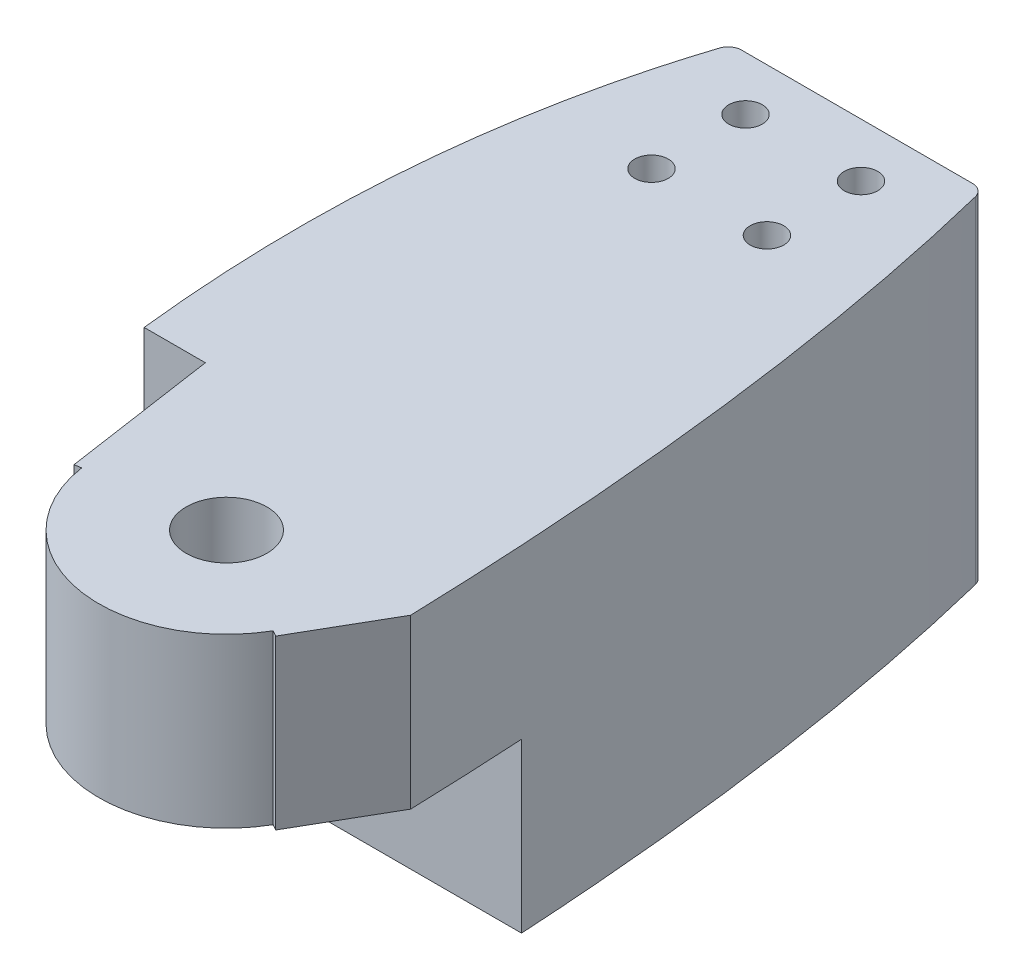
ISO-10303-21;
HEADER;
FILE_DESCRIPTION(('STEP AP214'),'2;1');
FILE_NAME('part.step','',(''),(''),'','','');
FILE_SCHEMA(('AUTOMOTIVE_DESIGN { 1 0 10303 214 1 1 1 1 }'));
ENDSEC;
DATA;
#1=APPLICATION_CONTEXT('core data for automotive mechanical design processes');
#2=APPLICATION_PROTOCOL_DEFINITION('international standard','automotive_design',2000,#1);
#3=PRODUCT_CONTEXT('',#1,'mechanical');
#4=PRODUCT('Part','Part','',(#3));
#5=PRODUCT_RELATED_PRODUCT_CATEGORY('part','',(#4));
#6=PRODUCT_DEFINITION_FORMATION('','',#4);
#7=PRODUCT_DEFINITION_CONTEXT('part definition',#1,'design');
#8=PRODUCT_DEFINITION('design','',#6,#7);
#9=PRODUCT_DEFINITION_SHAPE('','',#8);
#10=(LENGTH_UNIT() NAMED_UNIT(*) SI_UNIT(.MILLI.,.METRE.));
#11=(NAMED_UNIT(*) PLANE_ANGLE_UNIT() SI_UNIT($,.RADIAN.));
#12=(NAMED_UNIT(*) SI_UNIT($,.STERADIAN.) SOLID_ANGLE_UNIT());
#13=UNCERTAINTY_MEASURE_WITH_UNIT(LENGTH_MEASURE(1.E-05),#10,'distance_accuracy_value','');
#14=(GEOMETRIC_REPRESENTATION_CONTEXT(3) GLOBAL_UNCERTAINTY_ASSIGNED_CONTEXT((#13)) GLOBAL_UNIT_ASSIGNED_CONTEXT((#10,
#11,#12)) REPRESENTATION_CONTEXT('',''));
#15=CARTESIAN_POINT('',(0.,0.,0.));
#16=DIRECTION('',(0.,0.,1.));
#17=DIRECTION('',(1.,0.,0.));
#18=AXIS2_PLACEMENT_3D('',#15,#16,#17);
#19=CARTESIAN_POINT('',(0.,0.,0.));
#20=DIRECTION('',(0.,0.,-1.));
#21=DIRECTION('',(-1.,0.,0.));
#22=AXIS2_PLACEMENT_3D('',#19,#20,#21);
#23=PLANE('',#22);
#24=DIRECTION('',(-1.,0.,0.));
#25=VECTOR('',#24,1.);
#26=CARTESIAN_POINT('',(3.4106537573047,10.,0.));
#27=LINE('',#26,#25);
#28=CARTESIAN_POINT('',(3.4106537573047,10.,0.));
#29=VERTEX_POINT('',#28);
#30=CARTESIAN_POINT('',(-1.18269285677627,10.,0.));
#31=VERTEX_POINT('',#30);
#32=EDGE_CURVE('E282',#29,#31,#27,.T.);
#33=ORIENTED_EDGE('',*,*,#32,.T.);
#34=DIRECTION('',(0.,-1.,0.));
#35=VECTOR('',#34,1.);
#36=CARTESIAN_POINT('',(-1.18269285677627,10.,0.));
#37=LINE('',#36,#35);
#38=CARTESIAN_POINT('',(-1.18269285677627,-10.,0.));
#39=VERTEX_POINT('',#38);
#40=EDGE_CURVE('E264',#31,#39,#37,.T.);
#41=ORIENTED_EDGE('',*,*,#40,.T.);
#42=DIRECTION('',(-1.,0.,0.));
#43=VECTOR('',#42,1.);
#44=CARTESIAN_POINT('',(3.4106537573047,-10.,0.));
#45=LINE('',#44,#43);
#46=CARTESIAN_POINT('',(3.4106537573047,-10.,0.));
#47=VERTEX_POINT('',#46);
#48=EDGE_CURVE('E271',#47,#39,#45,.T.);
#49=ORIENTED_EDGE('',*,*,#48,.F.);
#50=DIRECTION('',(0.,-1.,0.));
#51=VECTOR('',#50,1.);
#52=CARTESIAN_POINT('',(3.4106537573047,10.,0.));
#53=LINE('',#52,#51);
#54=EDGE_CURVE('E963',#29,#47,#53,.T.);
#55=ORIENTED_EDGE('',*,*,#54,.F.);
#56=EDGE_LOOP('',(#33,#41,#49,#55));
#57=FACE_BOUND('',#56,.T.);
#58=DIRECTION('',(1.,0.,0.));
#59=VECTOR('',#58,1.);
#60=CARTESIAN_POINT('',(-12.5,12.5,0.));
#61=LINE('',#60,#59);
#62=CARTESIAN_POINT('',(-11.7760394708572,12.5,0.));
#63=VERTEX_POINT('',#62);
#64=CARTESIAN_POINT('',(5.4106537573047,12.5,0.));
#65=VERTEX_POINT('',#64);
#66=EDGE_CURVE('E492',#63,#65,#61,.T.);
#67=ORIENTED_EDGE('',*,*,#66,.T.);
#68=DIRECTION('',(0.,-1.,0.));
#69=VECTOR('',#68,1.);
#70=CARTESIAN_POINT('',(5.4106537573047,0.,0.));
#71=LINE('',#70,#69);
#72=CARTESIAN_POINT('',(5.4106537573047,-12.5,0.));
#73=VERTEX_POINT('',#72);
#74=EDGE_CURVE('E522',#65,#73,#71,.T.);
#75=ORIENTED_EDGE('',*,*,#74,.T.);
#76=DIRECTION('',(1.,0.,0.));
#77=VECTOR('',#76,1.);
#78=CARTESIAN_POINT('',(-12.5,-12.5,0.));
#79=LINE('',#78,#77);
#80=CARTESIAN_POINT('',(-11.7760394708572,-12.5,0.));
#81=VERTEX_POINT('',#80);
#82=EDGE_CURVE('E507',#81,#73,#79,.T.);
#83=ORIENTED_EDGE('',*,*,#82,.F.);
#84=DIRECTION('',(0.,-1.,0.));
#85=VECTOR('',#84,1.);
#86=CARTESIAN_POINT('',(-11.7760394708572,0.,0.));
#87=LINE('',#86,#85);
#88=EDGE_CURVE('E518',#81,#63,#87,.F.);
#89=ORIENTED_EDGE('',*,*,#88,.T.);
#90=EDGE_LOOP('',(#67,#75,#83,#89));
#91=FACE_BOUND('',#90,.T.);
#92=DIRECTION('',(0.,-1.,0.));
#93=VECTOR('',#92,1.);
#94=CARTESIAN_POINT('',(-5.18269285677627,10.,0.));
#95=LINE('',#94,#93);
#96=CARTESIAN_POINT('',(-5.18269285677627,10.,0.));
#97=VERTEX_POINT('',#96);
#98=CARTESIAN_POINT('',(-5.18269285677627,-10.,0.));
#99=VERTEX_POINT('',#98);
#100=EDGE_CURVE('E295',#97,#99,#95,.T.);
#101=ORIENTED_EDGE('',*,*,#100,.F.);
#102=DIRECTION('',(1.,0.,0.));
#103=VECTOR('',#102,1.);
#104=CARTESIAN_POINT('',(-9.77603947085724,10.,0.));
#105=LINE('',#104,#103);
#106=CARTESIAN_POINT('',(-9.77603947085724,10.,0.));
#107=VERTEX_POINT('',#106);
#108=EDGE_CURVE('E318',#107,#97,#105,.T.);
#109=ORIENTED_EDGE('',*,*,#108,.F.);
#110=DIRECTION('',(0.,-1.,0.));
#111=VECTOR('',#110,1.);
#112=CARTESIAN_POINT('',(-9.77603947085724,10.,0.));
#113=LINE('',#112,#111);
#114=CARTESIAN_POINT('',(-9.77603947085724,-10.,0.));
#115=VERTEX_POINT('',#114);
#116=EDGE_CURVE('E305',#107,#115,#113,.T.);
#117=ORIENTED_EDGE('',*,*,#116,.T.);
#118=DIRECTION('',(1.,0.,0.));
#119=VECTOR('',#118,1.);
#120=CARTESIAN_POINT('',(-9.77603947085724,-10.,0.));
#121=LINE('',#120,#119);
#122=EDGE_CURVE('E279',#115,#99,#121,.T.);
#123=ORIENTED_EDGE('',*,*,#122,.T.);
#124=EDGE_LOOP('',(#101,#109,#117,#123));
#125=FACE_BOUND('',#124,.T.);
#126=ADVANCED_FACE('F119',(#57,#91,#125),#23,.T.);
#127=CARTESIAN_POINT('',(1.11398045026422,22.,4.));
#128=DIRECTION('',(0.,-1.,0.));
#129=DIRECTION('',(0.,0.,-1.));
#130=AXIS2_PLACEMENT_3D('',#127,#128,#129);
#131=CYLINDRICAL_SURFACE('',#130,1.25);
#132=CARTESIAN_POINT('',(1.11398045026422,-12.5,4.));
#133=DIRECTION('',(0.,1.,0.));
#134=DIRECTION('',(0.,0.,1.));
#135=AXIS2_PLACEMENT_3D('',#132,#133,#134);
#136=CIRCLE('',#135,1.25);
#137=CARTESIAN_POINT('',(1.11398045026422,-12.5,5.25));
#138=VERTEX_POINT('',#137);
#139=EDGE_CURVE('E351',#138,#138,#136,.F.);
#140=ORIENTED_EDGE('',*,*,#139,.T.);
#141=EDGE_LOOP('',(#140));
#142=FACE_BOUND('',#141,.T.);
#143=CARTESIAN_POINT('',(1.11398045026422,-10.,4.));
#144=DIRECTION('',(0.,1.,0.));
#145=DIRECTION('',(0.,0.,1.));
#146=AXIS2_PLACEMENT_3D('',#143,#144,#145);
#147=CIRCLE('',#146,1.25);
#148=CARTESIAN_POINT('',(1.11398045026422,-10.,5.25));
#149=VERTEX_POINT('',#148);
#150=EDGE_CURVE('E289',#149,#149,#147,.T.);
#151=ORIENTED_EDGE('',*,*,#150,.T.);
#152=EDGE_LOOP('',(#151));
#153=FACE_BOUND('',#152,.T.);
#154=ADVANCED_FACE('F579',(#142,#153),#131,.F.);
#155=CARTESIAN_POINT('',(-7.47936616381675,22.,11.));
#156=DIRECTION('',(0.,-1.,0.));
#157=DIRECTION('',(0.,0.,-1.));
#158=AXIS2_PLACEMENT_3D('',#155,#156,#157);
#159=CYLINDRICAL_SURFACE('',#158,1.25);
#160=CARTESIAN_POINT('',(-7.47936616381675,12.5,11.));
#161=DIRECTION('',(0.,1.,0.));
#162=DIRECTION('',(0.,0.,1.));
#163=AXIS2_PLACEMENT_3D('',#160,#161,#162);
#164=CIRCLE('',#163,1.25);
#165=CARTESIAN_POINT('',(-7.47936616381675,12.5,12.25));
#166=VERTEX_POINT('',#165);
#167=EDGE_CURVE('E357',#166,#166,#164,.F.);
#168=ORIENTED_EDGE('',*,*,#167,.F.);
#169=EDGE_LOOP('',(#168));
#170=FACE_BOUND('',#169,.T.);
#171=CARTESIAN_POINT('',(-7.47936616381675,10.,11.));
#172=DIRECTION('',(0.,-1.,0.));
#173=DIRECTION('',(0.,0.,-1.));
#174=AXIS2_PLACEMENT_3D('',#171,#172,#173);
#175=CIRCLE('',#174,1.25);
#176=CARTESIAN_POINT('',(-7.47936616381675,10.,9.75));
#177=VERTEX_POINT('',#176);
#178=EDGE_CURVE('E347',#177,#177,#175,.T.);
#179=ORIENTED_EDGE('',*,*,#178,.T.);
#180=EDGE_LOOP('',(#179));
#181=FACE_BOUND('',#180,.T.);
#182=ADVANCED_FACE('F583',(#170,#181),#159,.F.);
#183=CARTESIAN_POINT('',(-7.47936616381675,22.,4.));
#184=DIRECTION('',(0.,-1.,0.));
#185=DIRECTION('',(0.,0.,-1.));
#186=AXIS2_PLACEMENT_3D('',#183,#184,#185);
#187=CYLINDRICAL_SURFACE('',#186,1.25);
#188=CARTESIAN_POINT('',(-7.47936616381675,12.5,4.));
#189=DIRECTION('',(0.,1.,0.));
#190=DIRECTION('',(0.,0.,1.));
#191=AXIS2_PLACEMENT_3D('',#188,#189,#190);
#192=CIRCLE('',#191,1.25);
#193=CARTESIAN_POINT('',(-7.47936616381675,12.5,5.25));
#194=VERTEX_POINT('',#193);
#195=EDGE_CURVE('E362',#194,#194,#192,.T.);
#196=ORIENTED_EDGE('',*,*,#195,.T.);
#197=EDGE_LOOP('',(#196));
#198=FACE_BOUND('',#197,.T.);
#199=CARTESIAN_POINT('',(-7.47936616381675,10.,4.));
#200=DIRECTION('',(0.,-1.,0.));
#201=DIRECTION('',(0.,0.,-1.));
#202=AXIS2_PLACEMENT_3D('',#199,#200,#201);
#203=CIRCLE('',#202,1.25);
#204=CARTESIAN_POINT('',(-7.47936616381675,10.,2.75));
#205=VERTEX_POINT('',#204);
#206=EDGE_CURVE('E123',#205,#205,#203,.F.);
#207=ORIENTED_EDGE('',*,*,#206,.F.);
#208=EDGE_LOOP('',(#207));
#209=FACE_BOUND('',#208,.T.);
#210=ADVANCED_FACE('F590',(#198,#209),#187,.F.);
#211=CARTESIAN_POINT('',(1.11398045026422,22.,11.));
#212=DIRECTION('',(0.,-1.,0.));
#213=DIRECTION('',(0.,0.,-1.));
#214=AXIS2_PLACEMENT_3D('',#211,#212,#213);
#215=CYLINDRICAL_SURFACE('',#214,1.25);
#216=CARTESIAN_POINT('',(1.11398045026422,-12.5,11.));
#217=DIRECTION('',(0.,1.,0.));
#218=DIRECTION('',(0.,0.,1.));
#219=AXIS2_PLACEMENT_3D('',#216,#217,#218);
#220=CIRCLE('',#219,1.25);
#221=CARTESIAN_POINT('',(1.11398045026422,-12.5,12.25));
#222=VERTEX_POINT('',#221);
#223=EDGE_CURVE('E366',#222,#222,#220,.T.);
#224=ORIENTED_EDGE('',*,*,#223,.F.);
#225=EDGE_LOOP('',(#224));
#226=FACE_BOUND('',#225,.T.);
#227=CARTESIAN_POINT('',(1.11398045026422,-10.,11.));
#228=DIRECTION('',(0.,1.,0.));
#229=DIRECTION('',(0.,0.,1.));
#230=AXIS2_PLACEMENT_3D('',#227,#228,#229);
#231=CIRCLE('',#230,1.25);
#232=CARTESIAN_POINT('',(1.11398045026422,-10.,12.25));
#233=VERTEX_POINT('',#232);
#234=EDGE_CURVE('E284',#233,#233,#231,.F.);
#235=ORIENTED_EDGE('',*,*,#234,.F.);
#236=EDGE_LOOP('',(#235));
#237=FACE_BOUND('',#236,.T.);
#238=ADVANCED_FACE('F613',(#226,#237),#215,.F.);
#239=CARTESIAN_POINT('',(-12.5,12.5,59.6073242287062));
#240=DIRECTION('',(0.,1.,0.));
#241=DIRECTION('',(0.,0.,1.));
#242=AXIS2_PLACEMENT_3D('',#239,#240,#241);
#243=PLANE('',#242);
#244=ORIENTED_EDGE('',*,*,#167,.T.);
#245=EDGE_LOOP('',(#244));
#246=FACE_BOUND('',#245,.T.);
#247=CARTESIAN_POINT('',(1.11398045026422,12.5,4.));
#248=DIRECTION('',(0.,1.,0.));
#249=DIRECTION('',(0.,0.,1.));
#250=AXIS2_PLACEMENT_3D('',#247,#248,#249);
#251=CIRCLE('',#250,1.25);
#252=CARTESIAN_POINT('',(1.11398045026422,12.5,5.25));
#253=VERTEX_POINT('',#252);
#254=EDGE_CURVE('E352',#253,#253,#251,.F.);
#255=ORIENTED_EDGE('',*,*,#254,.T.);
#256=EDGE_LOOP('',(#255));
#257=FACE_BOUND('',#256,.T.);
#258=CARTESIAN_POINT('',(0.,12.5,50.1073242287062));
#259=DIRECTION('',(0.,1.,0.));
#260=DIRECTION('',(0.,0.,1.));
#261=AXIS2_PLACEMENT_3D('',#258,#259,#260);
#262=CIRCLE('',#261,3.);
#263=CARTESIAN_POINT('',(0.,12.5,53.1073242287062));
#264=VERTEX_POINT('',#263);
#265=EDGE_CURVE('E453',#264,#264,#262,.T.);
#266=ORIENTED_EDGE('',*,*,#265,.F.);
#267=EDGE_LOOP('',(#266));
#268=FACE_BOUND('',#267,.T.);
#269=CARTESIAN_POINT('',(6.19130491193376,12.5,0.));
#270=CARTESIAN_POINT('',(12.5,12.5,24.9535219304764));
#271=CARTESIAN_POINT('',(12.5,12.5,59.6073242287062));
#272=B_SPLINE_CURVE_WITH_KNOTS('',2,(#269,#270,#271),.UNSPECIFIED.,.F.,.F.,(3,3),(0.,1.),.UNSPECIFIED.);
#273=CARTESIAN_POINT('',(6.38136002762419,12.5,0.759730699500692));
#274=VERTEX_POINT('',#273);
#275=CARTESIAN_POINT('',(12.3376268979581,12.5,48.7379275896188));
#276=VERTEX_POINT('',#275);
#277=EDGE_CURVE('E458',#274,#276,#272,.T.);
#278=ORIENTED_EDGE('',*,*,#277,.F.);
#279=CARTESIAN_POINT('',(5.4106537573047,12.5,1.));
#280=DIRECTION('',(0.,1.,0.));
#281=DIRECTION('',(0.,0.,1.));
#282=AXIS2_PLACEMENT_3D('',#279,#280,#281);
#283=CIRCLE('',#282,1.);
#284=EDGE_CURVE('E129',#274,#65,#283,.T.);
#285=ORIENTED_EDGE('',*,*,#284,.T.);
#286=ORIENTED_EDGE('',*,*,#66,.F.);
#287=CARTESIAN_POINT('',(-11.7760394708572,12.5,0.999999999999996));
#288=DIRECTION('',(0.,1.,0.));
#289=DIRECTION('',(0.,0.,1.));
#290=AXIS2_PLACEMENT_3D('',#287,#288,#289);
#291=CIRCLE('',#290,1.);
#292=CARTESIAN_POINT('',(-12.7274744096508,12.5,0.69215010598854));
#293=VERTEX_POINT('',#292);
#294=EDGE_CURVE('E535',#63,#293,#291,.T.);
#295=ORIENTED_EDGE('',*,*,#294,.T.);
#296=CARTESIAN_POINT('',(-12.5,12.5,59.6073242287062));
#297=CARTESIAN_POINT('',(-21.1491486629001,12.5,25.9147055713811));
#298=CARTESIAN_POINT('',(-12.5,12.5,0.));
#299=B_SPLINE_CURVE_WITH_KNOTS('',2,(#296,#297,#298),.UNSPECIFIED.,.F.,.F.,(3,3),(0.,1.),.UNSPECIFIED.);
#300=CARTESIAN_POINT('',(-16.1309249026159,12.5,40.1073242287062));
#301=VERTEX_POINT('',#300);
#302=EDGE_CURVE('E485',#301,#293,#299,.T.);
#303=ORIENTED_EDGE('',*,*,#302,.F.);
#304=DIRECTION('',(-1.,0.,0.));
#305=VECTOR('',#304,1.);
#306=CARTESIAN_POINT('',(-12.5,12.5,40.1073242287062));
#307=LINE('',#306,#305);
#308=CARTESIAN_POINT('',(-11.5746600755396,12.5,40.1073242287062));
#309=VERTEX_POINT('',#308);
#310=EDGE_CURVE('E384',#309,#301,#307,.T.);
#311=ORIENTED_EDGE('',*,*,#310,.F.);
#312=DIRECTION('',(0.145199622660322,0.,0.989402380014977));
#313=VECTOR('',#312,1.);
#314=CARTESIAN_POINT('',(-8.79278233415323,12.5,59.0632719633453));
#315=LINE('',#314,#313);
#316=CARTESIAN_POINT('',(-9.89402380014977,12.5,51.5593204553094));
#317=VERTEX_POINT('',#316);
#318=EDGE_CURVE('E393',#309,#317,#315,.T.);
#319=ORIENTED_EDGE('',*,*,#318,.T.);
#320=DIRECTION('',(0.989402380014977,0.,-0.145199622660322));
#321=VECTOR('',#320,1.);
#322=CARTESIAN_POINT('',(-13.6012414659965,12.5,52.1033727206703));
#323=LINE('',#322,#321);
#324=CARTESIAN_POINT('',(-9.39932261014228,12.5,51.4867206439792));
#325=VERTEX_POINT('',#324);
#326=EDGE_CURVE('E397',#317,#325,#323,.T.);
#327=ORIENTED_EDGE('',*,*,#326,.T.);
#328=CARTESIAN_POINT('',(0.,12.5,50.1073242287062));
#329=DIRECTION('',(0.,1.,0.));
#330=DIRECTION('',(0.,0.,1.));
#331=AXIS2_PLACEMENT_3D('',#328,#329,#330);
#332=CIRCLE('',#331,9.5);
#333=CARTESIAN_POINT('',(8.22724133595218,12.5,54.8573242287062));
#334=VERTEX_POINT('',#333);
#335=EDGE_CURVE('E428',#325,#334,#332,.T.);
#336=ORIENTED_EDGE('',*,*,#335,.T.);
#337=DIRECTION('',(-0.866025403784439,0.,-0.5));
#338=VECTOR('',#337,1.);
#339=CARTESIAN_POINT('',(-5.26137933202391,12.5,47.0696654550534));
#340=LINE('',#339,#338);
#341=CARTESIAN_POINT('',(8.6602540378444,12.5,55.1073242287062));
#342=VERTEX_POINT('',#341);
#343=EDGE_CURVE('E416',#342,#334,#340,.T.);
#344=ORIENTED_EDGE('',*,*,#343,.F.);
#345=DIRECTION('',(-0.500000000000715,0.,0.866025403784026));
#346=VECTOR('',#345,1.);
#347=CARTESIAN_POINT('',(1.42163336985131,12.5,67.6449830023644));
#348=LINE('',#347,#346);
#349=EDGE_CURVE('E425',#276,#342,#348,.T.);
#350=ORIENTED_EDGE('',*,*,#349,.F.);
#351=EDGE_LOOP('',(#278,#285,#286,#295,#303,#311,#319,#327,#336,#344,#350));
#352=FACE_BOUND('',#351,.T.);
#353=ORIENTED_EDGE('',*,*,#195,.F.);
#354=EDGE_LOOP('',(#353));
#355=FACE_BOUND('',#354,.T.);
#356=CARTESIAN_POINT('',(1.11398045026422,12.5,11.));
#357=DIRECTION('',(0.,1.,0.));
#358=DIRECTION('',(0.,0.,1.));
#359=AXIS2_PLACEMENT_3D('',#356,#357,#358);
#360=CIRCLE('',#359,1.25);
#361=CARTESIAN_POINT('',(1.11398045026422,12.5,12.25));
#362=VERTEX_POINT('',#361);
#363=EDGE_CURVE('E367',#362,#362,#360,.T.);
#364=ORIENTED_EDGE('',*,*,#363,.F.);
#365=EDGE_LOOP('',(#364));
#366=FACE_BOUND('',#365,.T.);
#367=ADVANCED_FACE('F609',(#246,#257,#268,#352,#355,#366),#243,.T.);
#368=CARTESIAN_POINT('',(-12.5,-12.5,59.6073242287062));
#369=DIRECTION('',(0.,1.,0.));
#370=DIRECTION('',(0.,0.,1.));
#371=AXIS2_PLACEMENT_3D('',#368,#369,#370);
#372=PLANE('',#371);
#373=CARTESIAN_POINT('',(-7.47936616381675,-12.5,4.));
#374=DIRECTION('',(0.,1.,0.));
#375=DIRECTION('',(0.,0.,1.));
#376=AXIS2_PLACEMENT_3D('',#373,#374,#375);
#377=CIRCLE('',#376,1.25);
#378=CARTESIAN_POINT('',(-7.47936616381675,-12.5,5.25));
#379=VERTEX_POINT('',#378);
#380=EDGE_CURVE('E361',#379,#379,#377,.T.);
#381=ORIENTED_EDGE('',*,*,#380,.T.);
#382=EDGE_LOOP('',(#381));
#383=FACE_BOUND('',#382,.T.);
#384=CARTESIAN_POINT('',(-7.47936616381675,-12.5,11.));
#385=DIRECTION('',(0.,1.,0.));
#386=DIRECTION('',(0.,0.,1.));
#387=AXIS2_PLACEMENT_3D('',#384,#385,#386);
#388=CIRCLE('',#387,1.25);
#389=CARTESIAN_POINT('',(-7.47936616381675,-12.5,12.25));
#390=VERTEX_POINT('',#389);
#391=EDGE_CURVE('E356',#390,#390,#388,.F.);
#392=ORIENTED_EDGE('',*,*,#391,.F.);
#393=EDGE_LOOP('',(#392));
#394=FACE_BOUND('',#393,.T.);
#395=ORIENTED_EDGE('',*,*,#139,.F.);
#396=EDGE_LOOP('',(#395));
#397=FACE_BOUND('',#396,.T.);
#398=ORIENTED_EDGE('',*,*,#82,.T.);
#399=CARTESIAN_POINT('',(5.4106537573047,-12.5,1.));
#400=DIRECTION('',(0.,1.,0.));
#401=DIRECTION('',(0.,0.,1.));
#402=AXIS2_PLACEMENT_3D('',#399,#400,#401);
#403=CIRCLE('',#402,1.);
#404=CARTESIAN_POINT('',(6.38136002762419,-12.5,0.759730699500691));
#405=VERTEX_POINT('',#404);
#406=EDGE_CURVE('E529',#73,#405,#403,.F.);
#407=ORIENTED_EDGE('',*,*,#406,.T.);
#408=CARTESIAN_POINT('',(6.19130491193376,-12.5,0.));
#409=CARTESIAN_POINT('',(12.5,-12.5,24.9535219304764));
#410=CARTESIAN_POINT('',(12.5,-12.5,59.6073242287062));
#411=B_SPLINE_CURVE_WITH_KNOTS('',2,(#408,#409,#410),.UNSPECIFIED.,.F.,.F.,(3,3),(0.,1.),.UNSPECIFIED.);
#412=CARTESIAN_POINT('',(11.9569143907422,-12.5,40.1073242287062));
#413=VERTEX_POINT('',#412);
#414=EDGE_CURVE('E457',#405,#413,#411,.T.);
#415=ORIENTED_EDGE('',*,*,#414,.T.);
#416=DIRECTION('',(1.,0.,0.));
#417=VECTOR('',#416,1.);
#418=CARTESIAN_POINT('',(-26.7210980894248,-12.5,40.1073242287062));
#419=LINE('',#418,#417);
#420=CARTESIAN_POINT('',(-16.1309249026159,-12.5,40.1073242287062));
#421=VERTEX_POINT('',#420);
#422=EDGE_CURVE('E436',#421,#413,#419,.T.);
#423=ORIENTED_EDGE('',*,*,#422,.F.);
#424=CARTESIAN_POINT('',(-12.5,-12.5,59.6073242287062));
#425=CARTESIAN_POINT('',(-21.1491486629001,-12.5,25.9147055713811));
#426=CARTESIAN_POINT('',(-12.5,-12.5,0.));
#427=B_SPLINE_CURVE_WITH_KNOTS('',2,(#424,#425,#426),.UNSPECIFIED.,.F.,.F.,(3,3),(0.,1.),.UNSPECIFIED.);
#428=CARTESIAN_POINT('',(-12.7274744096508,-12.5,0.69215010598854));
#429=VERTEX_POINT('',#428);
#430=EDGE_CURVE('E464',#421,#429,#427,.T.);
#431=ORIENTED_EDGE('',*,*,#430,.T.);
#432=CARTESIAN_POINT('',(-11.7760394708572,-12.5,0.999999999999996));
#433=DIRECTION('',(0.,1.,0.));
#434=DIRECTION('',(0.,0.,1.));
#435=AXIS2_PLACEMENT_3D('',#432,#433,#434);
#436=CIRCLE('',#435,1.);
#437=EDGE_CURVE('E526',#429,#81,#436,.F.);
#438=ORIENTED_EDGE('',*,*,#437,.T.);
#439=EDGE_LOOP('',(#398,#407,#415,#423,#431,#438));
#440=FACE_BOUND('',#439,.T.);
#441=ORIENTED_EDGE('',*,*,#223,.T.);
#442=EDGE_LOOP('',(#441));
#443=FACE_BOUND('',#442,.T.);
#444=ADVANCED_FACE('F612',(#383,#394,#397,#440,#443),#372,.F.);
#445=CARTESIAN_POINT('',(-26.7210980894248,0.,40.1073242287062));
#446=DIRECTION('',(0.,1.,0.));
#447=DIRECTION('',(0.,0.,1.));
#448=AXIS2_PLACEMENT_3D('',#445,#446,#447);
#449=PLANE('',#448);
#450=CARTESIAN_POINT('',(0.,0.,50.1073242287062));
#451=DIRECTION('',(0.,1.,0.));
#452=DIRECTION('',(0.,0.,1.));
#453=AXIS2_PLACEMENT_3D('',#450,#451,#452);
#454=CIRCLE('',#453,3.);
#455=CARTESIAN_POINT('',(0.,0.,53.1073242287062));
#456=VERTEX_POINT('',#455);
#457=EDGE_CURVE('E440',#456,#456,#454,.F.);
#458=ORIENTED_EDGE('',*,*,#457,.F.);
#459=EDGE_LOOP('',(#458));
#460=FACE_BOUND('',#459,.T.);
#461=CARTESIAN_POINT('',(0.,0.,50.1073242287062));
#462=DIRECTION('',(0.,-1.,0.));
#463=DIRECTION('',(0.,0.,-1.));
#464=AXIS2_PLACEMENT_3D('',#461,#462,#463);
#465=CIRCLE('',#464,9.5);
#466=CARTESIAN_POINT('',(8.22724133595218,0.,54.8573242287062));
#467=VERTEX_POINT('',#466);
#468=CARTESIAN_POINT('',(-9.39932261014228,0.,51.4867206439792));
#469=VERTEX_POINT('',#468);
#470=EDGE_CURVE('E401',#467,#469,#465,.T.);
#471=ORIENTED_EDGE('',*,*,#470,.T.);
#472=DIRECTION('',(-0.989402380014977,0.,0.145199622660322));
#473=VECTOR('',#472,1.);
#474=CARTESIAN_POINT('',(7.1984609020316,0.,49.0509149984249));
#475=LINE('',#474,#473);
#476=CARTESIAN_POINT('',(-9.89402380014977,0.,51.5593204553094));
#477=VERTEX_POINT('',#476);
#478=EDGE_CURVE('E375',#469,#477,#475,.T.);
#479=ORIENTED_EDGE('',*,*,#478,.T.);
#480=DIRECTION('',(-0.145199622660322,0.,-0.989402380014977));
#481=VECTOR('',#480,1.);
#482=CARTESIAN_POINT('',(-17.0924847021814,0.,2.50840545688448));
#483=LINE('',#482,#481);
#484=CARTESIAN_POINT('',(-11.5746600755396,0.,40.1073242287062));
#485=VERTEX_POINT('',#484);
#486=EDGE_CURVE('E371',#477,#485,#483,.T.);
#487=ORIENTED_EDGE('',*,*,#486,.T.);
#488=DIRECTION('',(-1.,0.,0.));
#489=VECTOR('',#488,1.);
#490=CARTESIAN_POINT('',(-26.7210980894248,0.,40.1073242287062));
#491=LINE('',#490,#489);
#492=CARTESIAN_POINT('',(11.9569143907421,0.,40.1073242287062));
#493=VERTEX_POINT('',#492);
#494=EDGE_CURVE('E432',#493,#485,#491,.T.);
#495=ORIENTED_EDGE('',*,*,#494,.F.);
#496=CARTESIAN_POINT('',(6.19130491193376,0.,0.));
#497=CARTESIAN_POINT('',(12.5,0.,24.9535219304764));
#498=CARTESIAN_POINT('',(12.5,0.,59.6073242287062));
#499=B_SPLINE_CURVE_WITH_KNOTS('',2,(#496,#497,#498),.UNSPECIFIED.,.F.,.F.,(3,3),(0.,1.),.UNSPECIFIED.);
#500=CARTESIAN_POINT('',(12.3376268979581,0.,48.7379275896188));
#501=VERTEX_POINT('',#500);
#502=EDGE_CURVE('E441',#493,#501,#499,.T.);
#503=ORIENTED_EDGE('',*,*,#502,.T.);
#504=DIRECTION('',(0.500000000000715,0.,-0.866025403784026));
#505=VECTOR('',#504,1.);
#506=CARTESIAN_POINT('',(30.3573618867225,0.,17.5268310572195));
#507=LINE('',#506,#505);
#508=CARTESIAN_POINT('',(8.6602540378444,0.,55.1073242287062));
#509=VERTEX_POINT('',#508);
#510=EDGE_CURVE('E408',#509,#501,#507,.T.);
#511=ORIENTED_EDGE('',*,*,#510,.F.);
#512=DIRECTION('',(0.866025403784439,0.,0.5));
#513=VECTOR('',#512,1.);
#514=CARTESIAN_POINT('',(-21.6971078488615,0.,37.5804931715296));
#515=LINE('',#514,#513);
#516=EDGE_CURVE('E404',#467,#509,#515,.T.);
#517=ORIENTED_EDGE('',*,*,#516,.F.);
#518=EDGE_LOOP('',(#471,#479,#487,#495,#503,#511,#517));
#519=FACE_BOUND('',#518,.T.);
#520=ADVANCED_FACE('F482',(#460,#519),#449,.F.);
#521=DIRECTION('',(0.,-1.,0.));
#522=VECTOR('',#521,1.);
#523=SURFACE_OF_LINEAR_EXTRUSION('',#299,#522);
#524=ORIENTED_EDGE('',*,*,#302,.T.);
#525=DIRECTION('',(0.,-1.,0.));
#526=VECTOR('',#525,1.);
#527=CARTESIAN_POINT('',(-12.7274744096508,12.5,0.69215010598854));
#528=LINE('',#527,#526);
#529=EDGE_CURVE('E13',#293,#429,#528,.T.);
#530=ORIENTED_EDGE('',*,*,#529,.T.);
#531=ORIENTED_EDGE('',*,*,#430,.F.);
#532=DIRECTION('',(0.,-1.,0.));
#533=VECTOR('',#532,1.);
#534=CARTESIAN_POINT('',(-16.1309249026159,12.5,40.1073242287062));
#535=LINE('',#534,#533);
#536=EDGE_CURVE('E447',#421,#301,#535,.F.);
#537=ORIENTED_EDGE('',*,*,#536,.T.);
#538=EDGE_LOOP('',(#524,#530,#531,#537));
#539=FACE_BOUND('',#538,.T.);
#540=ADVANCED_FACE('F477',(#539),#523,.T.);
#541=DIRECTION('',(0.,-1.,0.));
#542=VECTOR('',#541,1.);
#543=SURFACE_OF_LINEAR_EXTRUSION('',#272,#542);
#544=ORIENTED_EDGE('',*,*,#414,.F.);
#545=DIRECTION('',(0.,-1.,0.));
#546=VECTOR('',#545,1.);
#547=CARTESIAN_POINT('',(6.38136002762419,-12.5,0.759730699500691));
#548=LINE('',#547,#546);
#549=EDGE_CURVE('E532',#405,#274,#548,.F.);
#550=ORIENTED_EDGE('',*,*,#549,.T.);
#551=ORIENTED_EDGE('',*,*,#277,.T.);
#552=DIRECTION('',(0.,-1.,0.));
#553=VECTOR('',#552,1.);
#554=CARTESIAN_POINT('',(12.3376268979581,17.,48.7379275896188));
#555=LINE('',#554,#553);
#556=EDGE_CURVE('E412',#276,#501,#555,.T.);
#557=ORIENTED_EDGE('',*,*,#556,.T.);
#558=ORIENTED_EDGE('',*,*,#502,.F.);
#559=DIRECTION('',(0.,-1.,0.));
#560=VECTOR('',#559,1.);
#561=CARTESIAN_POINT('',(11.9569143907422,12.5,40.1073242287062));
#562=LINE('',#561,#560);
#563=EDGE_CURVE('E511',#493,#413,#562,.T.);
#564=ORIENTED_EDGE('',*,*,#563,.T.);
#565=EDGE_LOOP('',(#544,#550,#551,#557,#558,#564));
#566=FACE_BOUND('',#565,.T.);
#567=ADVANCED_FACE('F472',(#566),#543,.T.);
#568=CARTESIAN_POINT('',(0.,-23.8445328510129,50.1073242287062));
#569=DIRECTION('',(0.,1.,0.));
#570=DIRECTION('',(0.,0.,1.));
#571=AXIS2_PLACEMENT_3D('',#568,#569,#570);
#572=CYLINDRICAL_SURFACE('',#571,3.);
#573=ORIENTED_EDGE('',*,*,#457,.T.);
#574=EDGE_LOOP('',(#573));
#575=FACE_BOUND('',#574,.T.);
#576=ORIENTED_EDGE('',*,*,#265,.T.);
#577=EDGE_LOOP('',(#576));
#578=FACE_BOUND('',#577,.T.);
#579=ADVANCED_FACE('F476',(#575,#578),#572,.F.);
#580=CARTESIAN_POINT('',(0.,0.,40.1073242287062));
#581=DIRECTION('',(0.,0.,1.));
#582=DIRECTION('',(1.,0.,0.));
#583=AXIS2_PLACEMENT_3D('',#580,#581,#582);
#584=PLANE('',#583);
#585=ORIENTED_EDGE('',*,*,#422,.T.);
#586=ORIENTED_EDGE('',*,*,#563,.F.);
#587=ORIENTED_EDGE('',*,*,#494,.T.);
#588=DIRECTION('',(0.,-1.,0.));
#589=VECTOR('',#588,1.);
#590=CARTESIAN_POINT('',(-11.5746600755396,17.,40.1073242287062));
#591=LINE('',#590,#589);
#592=EDGE_CURVE('E379',#309,#485,#591,.T.);
#593=ORIENTED_EDGE('',*,*,#592,.F.);
#594=ORIENTED_EDGE('',*,*,#310,.T.);
#595=ORIENTED_EDGE('',*,*,#536,.F.);
#596=EDGE_LOOP('',(#585,#586,#587,#593,#594,#595));
#597=FACE_BOUND('',#596,.T.);
#598=ADVANCED_FACE('F693',(#597),#584,.T.);
#599=CARTESIAN_POINT('',(0.,17.,50.1073242287062));
#600=DIRECTION('',(0.,-1.,0.));
#601=DIRECTION('',(0.,0.,-1.));
#602=AXIS2_PLACEMENT_3D('',#599,#600,#601);
#603=CYLINDRICAL_SURFACE('',#602,9.5);
#604=ORIENTED_EDGE('',*,*,#335,.F.);
#605=DIRECTION('',(0.,-1.,0.));
#606=VECTOR('',#605,1.);
#607=CARTESIAN_POINT('',(-9.39932261014228,17.,51.4867206439792));
#608=LINE('',#607,#606);
#609=EDGE_CURVE('E380',#325,#469,#608,.T.);
#610=ORIENTED_EDGE('',*,*,#609,.T.);
#611=ORIENTED_EDGE('',*,*,#470,.F.);
#612=DIRECTION('',(0.,-1.,0.));
#613=VECTOR('',#612,1.);
#614=CARTESIAN_POINT('',(8.22724133595218,17.,54.8573242287062));
#615=LINE('',#614,#613);
#616=EDGE_CURVE('E411',#334,#467,#615,.T.);
#617=ORIENTED_EDGE('',*,*,#616,.F.);
#618=EDGE_LOOP('',(#604,#610,#611,#617));
#619=FACE_BOUND('',#618,.T.);
#620=ADVANCED_FACE('F720',(#619),#603,.T.);
#621=CARTESIAN_POINT('',(30.3573618867225,17.,17.5268310572195));
#622=DIRECTION('',(-0.866025403784026,0.,-0.500000000000715));
#623=DIRECTION('',(-0.500000000000715,0.,0.866025403784026));
#624=AXIS2_PLACEMENT_3D('',#621,#622,#623);
#625=PLANE('',#624);
#626=ORIENTED_EDGE('',*,*,#349,.T.);
#627=DIRECTION('',(0.,-1.,0.));
#628=VECTOR('',#627,1.);
#629=CARTESIAN_POINT('',(8.6602540378444,17.,55.1073242287062));
#630=LINE('',#629,#628);
#631=EDGE_CURVE('E417',#342,#509,#630,.T.);
#632=ORIENTED_EDGE('',*,*,#631,.T.);
#633=ORIENTED_EDGE('',*,*,#510,.T.);
#634=ORIENTED_EDGE('',*,*,#556,.F.);
#635=EDGE_LOOP('',(#626,#632,#633,#634));
#636=FACE_BOUND('',#635,.T.);
#637=ADVANCED_FACE('F713',(#636),#625,.F.);
#638=CARTESIAN_POINT('',(-21.6971078488615,17.,37.5804931715296));
#639=DIRECTION('',(0.5,0.,-0.866025403784439));
#640=DIRECTION('',(-0.866025403784439,0.,-0.5));
#641=AXIS2_PLACEMENT_3D('',#638,#639,#640);
#642=PLANE('',#641);
#643=ORIENTED_EDGE('',*,*,#343,.T.);
#644=ORIENTED_EDGE('',*,*,#616,.T.);
#645=ORIENTED_EDGE('',*,*,#516,.T.);
#646=ORIENTED_EDGE('',*,*,#631,.F.);
#647=EDGE_LOOP('',(#643,#644,#645,#646));
#648=FACE_BOUND('',#647,.T.);
#649=ADVANCED_FACE('F718',(#648),#642,.F.);
#650=CARTESIAN_POINT('',(7.1984609020316,17.,49.0509149984249));
#651=DIRECTION('',(0.145199622660322,0.,0.989402380014977));
#652=DIRECTION('',(0.989402380014977,0.,-0.145199622660322));
#653=AXIS2_PLACEMENT_3D('',#650,#651,#652);
#654=PLANE('',#653);
#655=DIRECTION('',(0.,-1.,0.));
#656=VECTOR('',#655,1.);
#657=CARTESIAN_POINT('',(-9.89402380014977,17.,51.5593204553094));
#658=LINE('',#657,#656);
#659=EDGE_CURVE('E385',#317,#477,#658,.T.);
#660=ORIENTED_EDGE('',*,*,#659,.T.);
#661=ORIENTED_EDGE('',*,*,#478,.F.);
#662=ORIENTED_EDGE('',*,*,#609,.F.);
#663=ORIENTED_EDGE('',*,*,#326,.F.);
#664=EDGE_LOOP('',(#660,#661,#662,#663));
#665=FACE_BOUND('',#664,.T.);
#666=ADVANCED_FACE('F724',(#665),#654,.T.);
#667=CARTESIAN_POINT('',(-17.0924847021814,17.,2.50840545688448));
#668=DIRECTION('',(-0.989402380014977,0.,0.145199622660322));
#669=DIRECTION('',(0.145199622660322,0.,0.989402380014977));
#670=AXIS2_PLACEMENT_3D('',#667,#668,#669);
#671=PLANE('',#670);
#672=ORIENTED_EDGE('',*,*,#592,.T.);
#673=ORIENTED_EDGE('',*,*,#486,.F.);
#674=ORIENTED_EDGE('',*,*,#659,.F.);
#675=ORIENTED_EDGE('',*,*,#318,.F.);
#676=EDGE_LOOP('',(#672,#673,#674,#675));
#677=FACE_BOUND('',#676,.T.);
#678=ADVANCED_FACE('F726',(#677),#671,.T.);
#679=CARTESIAN_POINT('',(5.4106537573047,0.,1.));
#680=DIRECTION('',(0.,-1.,0.));
#681=DIRECTION('',(0.,0.,-1.));
#682=AXIS2_PLACEMENT_3D('',#679,#680,#681);
#683=CYLINDRICAL_SURFACE('',#682,1.);
#684=ORIENTED_EDGE('',*,*,#284,.F.);
#685=ORIENTED_EDGE('',*,*,#549,.F.);
#686=ORIENTED_EDGE('',*,*,#406,.F.);
#687=ORIENTED_EDGE('',*,*,#74,.F.);
#688=EDGE_LOOP('',(#684,#685,#686,#687));
#689=FACE_BOUND('',#688,.T.);
#690=ADVANCED_FACE('F603',(#689),#683,.T.);
#691=CARTESIAN_POINT('',(-11.7760394708572,0.,0.999999999999996));
#692=DIRECTION('',(0.,-1.,0.));
#693=DIRECTION('',(0.,0.,-1.));
#694=AXIS2_PLACEMENT_3D('',#691,#692,#693);
#695=CYLINDRICAL_SURFACE('',#694,1.);
#696=ORIENTED_EDGE('',*,*,#437,.F.);
#697=ORIENTED_EDGE('',*,*,#529,.F.);
#698=ORIENTED_EDGE('',*,*,#294,.F.);
#699=ORIENTED_EDGE('',*,*,#88,.F.);
#700=EDGE_LOOP('',(#696,#697,#698,#699));
#701=FACE_BOUND('',#700,.T.);
#702=ADVANCED_FACE('F121',(#701),#695,.T.);
#703=CARTESIAN_POINT('',(1.11398045026422,10.,4.));
#704=DIRECTION('',(0.,1.,0.));
#705=DIRECTION('',(0.,0.,1.));
#706=AXIS2_PLACEMENT_3D('',#703,#704,#705);
#707=CIRCLE('',#706,1.25);
#708=CARTESIAN_POINT('',(1.11398045026422,10.,5.25));
#709=VERTEX_POINT('',#708);
#710=EDGE_CURVE('E338',#709,#709,#707,.T.);
#711=ORIENTED_EDGE('',*,*,#710,.F.);
#712=EDGE_LOOP('',(#711));
#713=FACE_BOUND('',#712,.T.);
#714=ORIENTED_EDGE('',*,*,#254,.F.);
#715=EDGE_LOOP('',(#714));
#716=FACE_BOUND('',#715,.T.);
#717=ADVANCED_FACE('F586',(#713,#716),#131,.F.);
#718=CARTESIAN_POINT('',(-7.47936616381675,-10.,11.));
#719=DIRECTION('',(0.,-1.,0.));
#720=DIRECTION('',(0.,0.,-1.));
#721=AXIS2_PLACEMENT_3D('',#718,#719,#720);
#722=CIRCLE('',#721,1.25);
#723=CARTESIAN_POINT('',(-7.47936616381675,-10.,9.75));
#724=VERTEX_POINT('',#723);
#725=EDGE_CURVE('E343',#724,#724,#722,.T.);
#726=ORIENTED_EDGE('',*,*,#725,.F.);
#727=EDGE_LOOP('',(#726));
#728=FACE_BOUND('',#727,.T.);
#729=ORIENTED_EDGE('',*,*,#391,.T.);
#730=EDGE_LOOP('',(#729));
#731=FACE_BOUND('',#730,.T.);
#732=ADVANCED_FACE('F592',(#728,#731),#159,.F.);
#733=CARTESIAN_POINT('',(-7.47936616381675,-10.,4.));
#734=DIRECTION('',(0.,-1.,0.));
#735=DIRECTION('',(0.,0.,-1.));
#736=AXIS2_PLACEMENT_3D('',#733,#734,#735);
#737=CIRCLE('',#736,1.25);
#738=CARTESIAN_POINT('',(-7.47936616381675,-10.,2.75));
#739=VERTEX_POINT('',#738);
#740=EDGE_CURVE('E342',#739,#739,#737,.F.);
#741=ORIENTED_EDGE('',*,*,#740,.T.);
#742=EDGE_LOOP('',(#741));
#743=FACE_BOUND('',#742,.T.);
#744=ORIENTED_EDGE('',*,*,#380,.F.);
#745=EDGE_LOOP('',(#744));
#746=FACE_BOUND('',#745,.T.);
#747=ADVANCED_FACE('F558',(#743,#746),#187,.F.);
#748=CARTESIAN_POINT('',(1.11398045026422,10.,11.));
#749=DIRECTION('',(0.,1.,0.));
#750=DIRECTION('',(0.,0.,1.));
#751=AXIS2_PLACEMENT_3D('',#748,#749,#750);
#752=CIRCLE('',#751,1.25);
#753=CARTESIAN_POINT('',(1.11398045026422,10.,12.25));
#754=VERTEX_POINT('',#753);
#755=EDGE_CURVE('E337',#754,#754,#752,.F.);
#756=ORIENTED_EDGE('',*,*,#755,.T.);
#757=EDGE_LOOP('',(#756));
#758=FACE_BOUND('',#757,.T.);
#759=ORIENTED_EDGE('',*,*,#363,.T.);
#760=EDGE_LOOP('',(#759));
#761=FACE_BOUND('',#760,.T.);
#762=ADVANCED_FACE('F626',(#758,#761),#215,.F.);
#763=CARTESIAN_POINT('',(0.,10.,0.));
#764=DIRECTION('',(0.,1.,0.));
#765=DIRECTION('',(0.,0.,1.));
#766=AXIS2_PLACEMENT_3D('',#763,#764,#765);
#767=PLANE('',#766);
#768=ORIENTED_EDGE('',*,*,#710,.T.);
#769=EDGE_LOOP('',(#768));
#770=FACE_BOUND('',#769,.T.);
#771=ORIENTED_EDGE('',*,*,#32,.F.);
#772=DIRECTION('',(0.,0.,1.));
#773=VECTOR('',#772,1.);
#774=CARTESIAN_POINT('',(3.4106537573047,10.,0.));
#775=LINE('',#774,#773);
#776=CARTESIAN_POINT('',(3.4106537573047,10.,15.));
#777=VERTEX_POINT('',#776);
#778=EDGE_CURVE('E958',#29,#777,#775,.T.);
#779=ORIENTED_EDGE('',*,*,#778,.T.);
#780=DIRECTION('',(-1.,0.,0.));
#781=VECTOR('',#780,1.);
#782=CARTESIAN_POINT('',(3.4106537573047,10.,15.));
#783=LINE('',#782,#781);
#784=CARTESIAN_POINT('',(-1.18269285677627,10.,15.));
#785=VERTEX_POINT('',#784);
#786=EDGE_CURVE('E952',#777,#785,#783,.T.);
#787=ORIENTED_EDGE('',*,*,#786,.T.);
#788=DIRECTION('',(0.,0.,1.));
#789=VECTOR('',#788,1.);
#790=CARTESIAN_POINT('',(-1.18269285677627,10.,0.));
#791=LINE('',#790,#789);
#792=EDGE_CURVE('E956',#31,#785,#791,.T.);
#793=ORIENTED_EDGE('',*,*,#792,.F.);
#794=EDGE_LOOP('',(#771,#779,#787,#793));
#795=FACE_BOUND('',#794,.T.);
#796=ORIENTED_EDGE('',*,*,#755,.F.);
#797=EDGE_LOOP('',(#796));
#798=FACE_BOUND('',#797,.T.);
#799=ADVANCED_FACE('F628',(#770,#795,#798),#767,.F.);
#800=CARTESIAN_POINT('',(0.,-10.,0.));
#801=DIRECTION('',(0.,1.,0.));
#802=DIRECTION('',(0.,0.,1.));
#803=AXIS2_PLACEMENT_3D('',#800,#801,#802);
#804=PLANE('',#803);
#805=ORIENTED_EDGE('',*,*,#150,.F.);
#806=EDGE_LOOP('',(#805));
#807=FACE_BOUND('',#806,.T.);
#808=ORIENTED_EDGE('',*,*,#48,.T.);
#809=DIRECTION('',(0.,0.,1.));
#810=VECTOR('',#809,1.);
#811=CARTESIAN_POINT('',(-1.18269285677627,-10.,0.));
#812=LINE('',#811,#810);
#813=CARTESIAN_POINT('',(-1.18269285677627,-10.,15.));
#814=VERTEX_POINT('',#813);
#815=EDGE_CURVE('E261',#39,#814,#812,.T.);
#816=ORIENTED_EDGE('',*,*,#815,.T.);
#817=DIRECTION('',(-1.,0.,0.));
#818=VECTOR('',#817,1.);
#819=CARTESIAN_POINT('',(3.4106537573047,-10.,15.));
#820=LINE('',#819,#818);
#821=CARTESIAN_POINT('',(3.4106537573047,-10.,15.));
#822=VERTEX_POINT('',#821);
#823=EDGE_CURVE('E270',#822,#814,#820,.T.);
#824=ORIENTED_EDGE('',*,*,#823,.F.);
#825=DIRECTION('',(0.,0.,1.));
#826=VECTOR('',#825,1.);
#827=CARTESIAN_POINT('',(3.4106537573047,-10.,0.));
#828=LINE('',#827,#826);
#829=EDGE_CURVE('E137',#47,#822,#828,.T.);
#830=ORIENTED_EDGE('',*,*,#829,.F.);
#831=EDGE_LOOP('',(#808,#816,#824,#830));
#832=FACE_BOUND('',#831,.T.);
#833=ORIENTED_EDGE('',*,*,#234,.T.);
#834=EDGE_LOOP('',(#833));
#835=FACE_BOUND('',#834,.T.);
#836=ADVANCED_FACE('F274',(#807,#832,#835),#804,.T.);
#837=CARTESIAN_POINT('',(-1.18269285677627,10.,0.));
#838=DIRECTION('',(1.,0.,0.));
#839=DIRECTION('',(0.,0.,-1.));
#840=AXIS2_PLACEMENT_3D('',#837,#838,#839);
#841=PLANE('',#840);
#842=ORIENTED_EDGE('',*,*,#40,.F.);
#843=ORIENTED_EDGE('',*,*,#792,.T.);
#844=DIRECTION('',(0.,-1.,0.));
#845=VECTOR('',#844,1.);
#846=CARTESIAN_POINT('',(-1.18269285677627,10.,15.));
#847=LINE('',#846,#845);
#848=EDGE_CURVE('E267',#785,#814,#847,.T.);
#849=ORIENTED_EDGE('',*,*,#848,.T.);
#850=ORIENTED_EDGE('',*,*,#815,.F.);
#851=EDGE_LOOP('',(#842,#843,#849,#850));
#852=FACE_BOUND('',#851,.T.);
#853=ADVANCED_FACE('F262',(#852),#841,.T.);
#854=CARTESIAN_POINT('',(3.4106537573047,10.,15.));
#855=DIRECTION('',(0.,0.,1.));
#856=DIRECTION('',(1.,0.,0.));
#857=AXIS2_PLACEMENT_3D('',#854,#855,#856);
#858=PLANE('',#857);
#859=ORIENTED_EDGE('',*,*,#848,.F.);
#860=ORIENTED_EDGE('',*,*,#786,.F.);
#861=DIRECTION('',(0.,-1.,0.));
#862=VECTOR('',#861,1.);
#863=CARTESIAN_POINT('',(3.4106537573047,10.,15.));
#864=LINE('',#863,#862);
#865=EDGE_CURVE('E291',#777,#822,#864,.T.);
#866=ORIENTED_EDGE('',*,*,#865,.T.);
#867=ORIENTED_EDGE('',*,*,#823,.T.);
#868=EDGE_LOOP('',(#859,#860,#866,#867));
#869=FACE_BOUND('',#868,.T.);
#870=ADVANCED_FACE('F652',(#869),#858,.F.);
#871=CARTESIAN_POINT('',(3.4106537573047,10.,0.));
#872=DIRECTION('',(1.,0.,0.));
#873=DIRECTION('',(0.,0.,-1.));
#874=AXIS2_PLACEMENT_3D('',#871,#872,#873);
#875=PLANE('',#874);
#876=ORIENTED_EDGE('',*,*,#865,.F.);
#877=ORIENTED_EDGE('',*,*,#778,.F.);
#878=ORIENTED_EDGE('',*,*,#54,.T.);
#879=ORIENTED_EDGE('',*,*,#829,.T.);
#880=EDGE_LOOP('',(#876,#877,#878,#879));
#881=FACE_BOUND('',#880,.T.);
#882=ADVANCED_FACE('F574',(#881),#875,.F.);
#883=CARTESIAN_POINT('',(0.,10.,0.));
#884=DIRECTION('',(0.,-1.,0.));
#885=DIRECTION('',(0.,0.,-1.));
#886=AXIS2_PLACEMENT_3D('',#883,#884,#885);
#887=PLANE('',#886);
#888=ORIENTED_EDGE('',*,*,#178,.F.);
#889=EDGE_LOOP('',(#888));
#890=FACE_BOUND('',#889,.T.);
#891=ORIENTED_EDGE('',*,*,#108,.T.);
#892=DIRECTION('',(0.,0.,1.));
#893=VECTOR('',#892,1.);
#894=CARTESIAN_POINT('',(-5.18269285677627,10.,0.));
#895=LINE('',#894,#893);
#896=CARTESIAN_POINT('',(-5.18269285677627,10.,15.));
#897=VERTEX_POINT('',#896);
#898=EDGE_CURVE('E314',#97,#897,#895,.T.);
#899=ORIENTED_EDGE('',*,*,#898,.T.);
#900=DIRECTION('',(1.,0.,0.));
#901=VECTOR('',#900,1.);
#902=CARTESIAN_POINT('',(-9.77603947085724,10.,15.));
#903=LINE('',#902,#901);
#904=CARTESIAN_POINT('',(-9.77603947085724,10.,15.));
#905=VERTEX_POINT('',#904);
#906=EDGE_CURVE('E311',#905,#897,#903,.T.);
#907=ORIENTED_EDGE('',*,*,#906,.F.);
#908=DIRECTION('',(0.,0.,1.));
#909=VECTOR('',#908,1.);
#910=CARTESIAN_POINT('',(-9.77603947085724,10.,0.));
#911=LINE('',#910,#909);
#912=EDGE_CURVE('E298',#107,#905,#911,.T.);
#913=ORIENTED_EDGE('',*,*,#912,.F.);
#914=EDGE_LOOP('',(#891,#899,#907,#913));
#915=FACE_BOUND('',#914,.T.);
#916=ORIENTED_EDGE('',*,*,#206,.T.);
#917=EDGE_LOOP('',(#916));
#918=FACE_BOUND('',#917,.T.);
#919=ADVANCED_FACE('F564',(#890,#915,#918),#887,.T.);
#920=CARTESIAN_POINT('',(0.,-10.,0.));
#921=DIRECTION('',(0.,-1.,0.));
#922=DIRECTION('',(0.,0.,-1.));
#923=AXIS2_PLACEMENT_3D('',#920,#921,#922);
#924=PLANE('',#923);
#925=ORIENTED_EDGE('',*,*,#725,.T.);
#926=EDGE_LOOP('',(#925));
#927=FACE_BOUND('',#926,.T.);
#928=ORIENTED_EDGE('',*,*,#122,.F.);
#929=DIRECTION('',(0.,0.,1.));
#930=VECTOR('',#929,1.);
#931=CARTESIAN_POINT('',(-9.77603947085724,-10.,0.));
#932=LINE('',#931,#930);
#933=CARTESIAN_POINT('',(-9.77603947085724,-10.,15.));
#934=VERTEX_POINT('',#933);
#935=EDGE_CURVE('E322',#115,#934,#932,.T.);
#936=ORIENTED_EDGE('',*,*,#935,.T.);
#937=DIRECTION('',(1.,0.,0.));
#938=VECTOR('',#937,1.);
#939=CARTESIAN_POINT('',(-9.77603947085724,-10.,15.));
#940=LINE('',#939,#938);
#941=CARTESIAN_POINT('',(-5.18269285677627,-10.,15.));
#942=VERTEX_POINT('',#941);
#943=EDGE_CURVE('E326',#934,#942,#940,.T.);
#944=ORIENTED_EDGE('',*,*,#943,.T.);
#945=DIRECTION('',(0.,0.,1.));
#946=VECTOR('',#945,1.);
#947=CARTESIAN_POINT('',(-5.18269285677627,-10.,0.));
#948=LINE('',#947,#946);
#949=EDGE_CURVE('E145',#99,#942,#948,.T.);
#950=ORIENTED_EDGE('',*,*,#949,.F.);
#951=EDGE_LOOP('',(#928,#936,#944,#950));
#952=FACE_BOUND('',#951,.T.);
#953=ORIENTED_EDGE('',*,*,#740,.F.);
#954=EDGE_LOOP('',(#953));
#955=FACE_BOUND('',#954,.T.);
#956=ADVANCED_FACE('F561',(#927,#952,#955),#924,.F.);
#957=CARTESIAN_POINT('',(-9.77603947085724,10.,0.));
#958=DIRECTION('',(1.,0.,0.));
#959=DIRECTION('',(0.,0.,-1.));
#960=AXIS2_PLACEMENT_3D('',#957,#958,#959);
#961=PLANE('',#960);
#962=ORIENTED_EDGE('',*,*,#116,.F.);
#963=ORIENTED_EDGE('',*,*,#912,.T.);
#964=DIRECTION('',(0.,-1.,0.));
#965=VECTOR('',#964,1.);
#966=CARTESIAN_POINT('',(-9.77603947085724,10.,15.));
#967=LINE('',#966,#965);
#968=EDGE_CURVE('E302',#905,#934,#967,.T.);
#969=ORIENTED_EDGE('',*,*,#968,.T.);
#970=ORIENTED_EDGE('',*,*,#935,.F.);
#971=EDGE_LOOP('',(#962,#963,#969,#970));
#972=FACE_BOUND('',#971,.T.);
#973=ADVANCED_FACE('F563',(#972),#961,.T.);
#974=CARTESIAN_POINT('',(-9.77603947085724,10.,15.));
#975=DIRECTION('',(0.,0.,-1.));
#976=DIRECTION('',(-1.,0.,0.));
#977=AXIS2_PLACEMENT_3D('',#974,#975,#976);
#978=PLANE('',#977);
#979=ORIENTED_EDGE('',*,*,#968,.F.);
#980=ORIENTED_EDGE('',*,*,#906,.T.);
#981=DIRECTION('',(0.,-1.,0.));
#982=VECTOR('',#981,1.);
#983=CARTESIAN_POINT('',(-5.18269285677627,10.,15.));
#984=LINE('',#983,#982);
#985=EDGE_CURVE('E299',#897,#942,#984,.T.);
#986=ORIENTED_EDGE('',*,*,#985,.T.);
#987=ORIENTED_EDGE('',*,*,#943,.F.);
#988=EDGE_LOOP('',(#979,#980,#986,#987));
#989=FACE_BOUND('',#988,.T.);
#990=ADVANCED_FACE('F571',(#989),#978,.T.);
#991=CARTESIAN_POINT('',(-5.18269285677627,10.,0.));
#992=DIRECTION('',(1.,0.,0.));
#993=DIRECTION('',(0.,0.,-1.));
#994=AXIS2_PLACEMENT_3D('',#991,#992,#993);
#995=PLANE('',#994);
#996=ORIENTED_EDGE('',*,*,#985,.F.);
#997=ORIENTED_EDGE('',*,*,#898,.F.);
#998=ORIENTED_EDGE('',*,*,#100,.T.);
#999=ORIENTED_EDGE('',*,*,#949,.T.);
#1000=EDGE_LOOP('',(#996,#997,#998,#999));
#1001=FACE_BOUND('',#1000,.T.);
#1002=ADVANCED_FACE('F662',(#1001),#995,.F.);
#1003=CLOSED_SHELL('',(#126,#154,#182,#210,#238,#367,#444,#520,#540,#567,#579,#598,#620,#637,
#649,#666,#678,#690,#702,#717,#732,#747,#762,#799,#836,#853,#870,#882,#919,#956,#973,#990,#1002));
#1004=MANIFOLD_SOLID_BREP('B2',#1003);
#1005=ADVANCED_BREP_SHAPE_REPRESENTATION('',(#18,#1004),#14);
#1006=SHAPE_DEFINITION_REPRESENTATION(#9,#1005);
ENDSEC;
END-ISO-10303-21;
